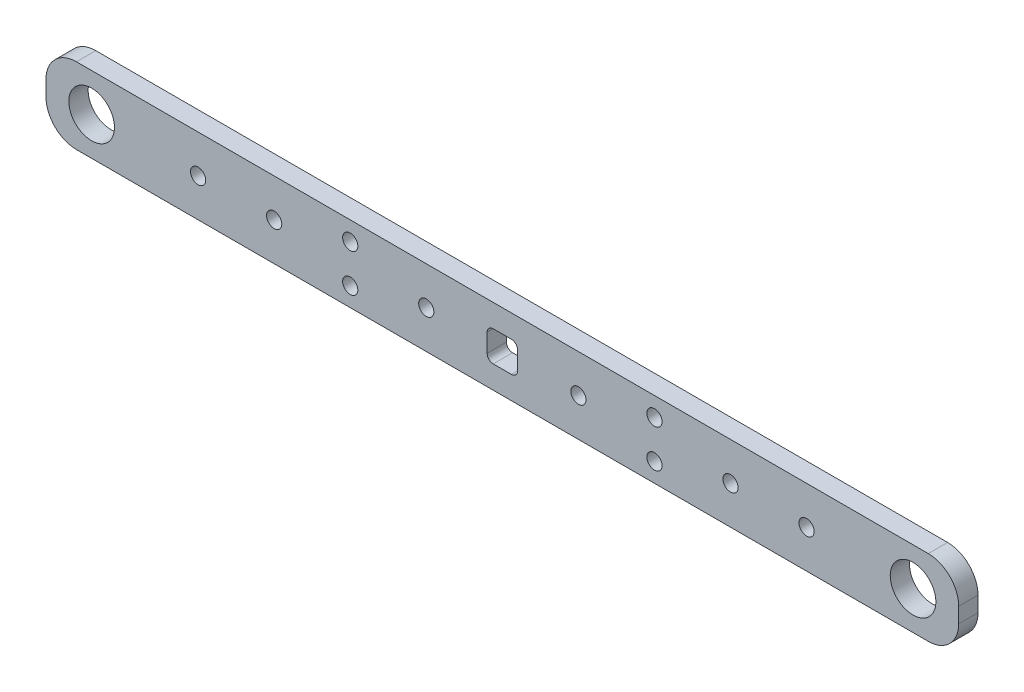
ISO-10303-21;
HEADER;
FILE_DESCRIPTION(('STEP AP214'),'2;1');
FILE_NAME('part.step','',(''),(''),'','','');
FILE_SCHEMA(('AUTOMOTIVE_DESIGN { 1 0 10303 214 1 1 1 1 }'));
ENDSEC;
DATA;
#1=APPLICATION_CONTEXT('core data for automotive mechanical design processes');
#2=APPLICATION_PROTOCOL_DEFINITION('international standard','automotive_design',2000,#1);
#3=PRODUCT_CONTEXT('',#1,'mechanical');
#4=PRODUCT('Part','Part','',(#3));
#5=PRODUCT_RELATED_PRODUCT_CATEGORY('part','',(#4));
#6=PRODUCT_DEFINITION_FORMATION('','',#4);
#7=PRODUCT_DEFINITION_CONTEXT('part definition',#1,'design');
#8=PRODUCT_DEFINITION('design','',#6,#7);
#9=PRODUCT_DEFINITION_SHAPE('','',#8);
#10=(LENGTH_UNIT() NAMED_UNIT(*) SI_UNIT(.MILLI.,.METRE.));
#11=(NAMED_UNIT(*) PLANE_ANGLE_UNIT() SI_UNIT($,.RADIAN.));
#12=(NAMED_UNIT(*) SI_UNIT($,.STERADIAN.) SOLID_ANGLE_UNIT());
#13=UNCERTAINTY_MEASURE_WITH_UNIT(LENGTH_MEASURE(1.E-05),#10,'distance_accuracy_value','');
#14=(GEOMETRIC_REPRESENTATION_CONTEXT(3) GLOBAL_UNCERTAINTY_ASSIGNED_CONTEXT((#13)) GLOBAL_UNIT_ASSIGNED_CONTEXT((#10,
#11,#12)) REPRESENTATION_CONTEXT('',''));
#15=CARTESIAN_POINT('',(0.,0.,0.));
#16=DIRECTION('',(0.,0.,1.));
#17=DIRECTION('',(1.,0.,0.));
#18=AXIS2_PLACEMENT_3D('',#15,#16,#17);
#19=CARTESIAN_POINT('',(0.,0.,3.175));
#20=DIRECTION('',(0.,0.,1.));
#21=DIRECTION('',(1.,0.,0.));
#22=AXIS2_PLACEMENT_3D('',#19,#20,#21);
#23=PLANE('',#22);
#24=CARTESIAN_POINT('',(100.,-4.45849784240948E-13,3.175));
#25=DIRECTION('',(0.,0.,1.));
#26=DIRECTION('',(1.,0.,0.));
#27=AXIS2_PLACEMENT_3D('',#24,#25,#26);
#28=CIRCLE('',#27,2.5);
#29=CARTESIAN_POINT('',(102.5,-4.45849784240948E-13,3.175));
#30=VERTEX_POINT('',#29);
#31=EDGE_CURVE('E342',#30,#30,#28,.T.);
#32=ORIENTED_EDGE('',*,*,#31,.F.);
#33=EDGE_LOOP('',(#32));
#34=FACE_BOUND('',#33,.T.);
#35=CARTESIAN_POINT('',(-100.,0.,3.175));
#36=DIRECTION('',(0.,0.,1.));
#37=DIRECTION('',(1.,0.,0.));
#38=AXIS2_PLACEMENT_3D('',#35,#36,#37);
#39=CIRCLE('',#38,2.5);
#40=CARTESIAN_POINT('',(-97.5,0.,3.175));
#41=VERTEX_POINT('',#40);
#42=EDGE_CURVE('E736',#41,#41,#39,.T.);
#43=ORIENTED_EDGE('',*,*,#42,.F.);
#44=EDGE_LOOP('',(#43));
#45=FACE_BOUND('',#44,.T.);
#46=CARTESIAN_POINT('',(50.,6.24999999999978,3.175));
#47=DIRECTION('',(0.,0.,1.));
#48=DIRECTION('',(1.,0.,0.));
#49=AXIS2_PLACEMENT_3D('',#46,#47,#48);
#50=CIRCLE('',#49,2.50000000000001);
#51=CARTESIAN_POINT('',(52.5,6.24999999999978,3.175));
#52=VERTEX_POINT('',#51);
#53=EDGE_CURVE('E732',#52,#52,#50,.T.);
#54=ORIENTED_EDGE('',*,*,#53,.F.);
#55=EDGE_LOOP('',(#54));
#56=FACE_BOUND('',#55,.T.);
#57=CARTESIAN_POINT('',(50.,-6.25000000000023,3.175));
#58=DIRECTION('',(0.,0.,1.));
#59=DIRECTION('',(1.,0.,0.));
#60=AXIS2_PLACEMENT_3D('',#57,#58,#59);
#61=CIRCLE('',#60,2.5);
#62=CARTESIAN_POINT('',(52.5,-6.25000000000023,3.175));
#63=VERTEX_POINT('',#62);
#64=EDGE_CURVE('E728',#63,#63,#61,.T.);
#65=ORIENTED_EDGE('',*,*,#64,.F.);
#66=EDGE_LOOP('',(#65));
#67=FACE_BOUND('',#66,.T.);
#68=CARTESIAN_POINT('',(-50.,-6.25000000000001,3.175));
#69=DIRECTION('',(0.,0.,1.));
#70=DIRECTION('',(1.,0.,0.));
#71=AXIS2_PLACEMENT_3D('',#68,#69,#70);
#72=CIRCLE('',#71,2.5);
#73=CARTESIAN_POINT('',(-47.5,-6.25000000000001,3.175));
#74=VERTEX_POINT('',#73);
#75=EDGE_CURVE('E724',#74,#74,#72,.T.);
#76=ORIENTED_EDGE('',*,*,#75,.F.);
#77=EDGE_LOOP('',(#76));
#78=FACE_BOUND('',#77,.T.);
#79=CARTESIAN_POINT('',(-50.,6.25,3.175));
#80=DIRECTION('',(0.,0.,1.));
#81=DIRECTION('',(1.,0.,0.));
#82=AXIS2_PLACEMENT_3D('',#79,#80,#81);
#83=CIRCLE('',#82,2.5);
#84=CARTESIAN_POINT('',(-47.5,6.25,3.175));
#85=VERTEX_POINT('',#84);
#86=EDGE_CURVE('E719',#85,#85,#83,.T.);
#87=ORIENTED_EDGE('',*,*,#86,.F.);
#88=EDGE_LOOP('',(#87));
#89=FACE_BOUND('',#88,.T.);
#90=CARTESIAN_POINT('',(75.,-3.33066907387547E-13,3.175));
#91=DIRECTION('',(0.,0.,1.));
#92=DIRECTION('',(1.,0.,0.));
#93=AXIS2_PLACEMENT_3D('',#90,#91,#92);
#94=CIRCLE('',#93,2.5);
#95=CARTESIAN_POINT('',(77.5,-3.33066907387547E-13,3.175));
#96=VERTEX_POINT('',#95);
#97=EDGE_CURVE('E367',#96,#96,#94,.T.);
#98=ORIENTED_EDGE('',*,*,#97,.F.);
#99=EDGE_LOOP('',(#98));
#100=FACE_BOUND('',#99,.T.);
#101=CARTESIAN_POINT('',(25.,-1.11022302462516E-13,3.175));
#102=DIRECTION('',(0.,0.,1.));
#103=DIRECTION('',(1.,0.,0.));
#104=AXIS2_PLACEMENT_3D('',#101,#102,#103);
#105=CIRCLE('',#104,2.5);
#106=CARTESIAN_POINT('',(27.5,-1.11022302462516E-13,3.175));
#107=VERTEX_POINT('',#106);
#108=EDGE_CURVE('E363',#107,#107,#105,.T.);
#109=ORIENTED_EDGE('',*,*,#108,.F.);
#110=EDGE_LOOP('',(#109));
#111=FACE_BOUND('',#110,.T.);
#112=DIRECTION('',(0.,1.,0.));
#113=VECTOR('',#112,1.);
#114=CARTESIAN_POINT('',(5.,0.,3.175));
#115=LINE('',#114,#113);
#116=CARTESIAN_POINT('',(5.,-3.,3.175));
#117=VERTEX_POINT('',#116);
#118=CARTESIAN_POINT('',(5.,3.,3.175));
#119=VERTEX_POINT('',#118);
#120=EDGE_CURVE('E360',#117,#119,#115,.T.);
#121=ORIENTED_EDGE('',*,*,#120,.F.);
#122=CARTESIAN_POINT('',(3.,-3.,3.175));
#123=DIRECTION('',(0.,0.,1.));
#124=DIRECTION('',(1.,0.,0.));
#125=AXIS2_PLACEMENT_3D('',#122,#123,#124);
#126=CIRCLE('',#125,2.);
#127=CARTESIAN_POINT('',(3.,-5.,3.175));
#128=VERTEX_POINT('',#127);
#129=EDGE_CURVE('E288',#117,#128,#126,.F.);
#130=ORIENTED_EDGE('',*,*,#129,.T.);
#131=DIRECTION('',(1.,0.,0.));
#132=VECTOR('',#131,1.);
#133=CARTESIAN_POINT('',(0.,-5.,3.175));
#134=LINE('',#133,#132);
#135=CARTESIAN_POINT('',(-3.,-5.,3.175));
#136=VERTEX_POINT('',#135);
#137=EDGE_CURVE('E356',#136,#128,#134,.T.);
#138=ORIENTED_EDGE('',*,*,#137,.F.);
#139=CARTESIAN_POINT('',(-3.,-3.,3.175));
#140=DIRECTION('',(0.,0.,1.));
#141=DIRECTION('',(1.,0.,0.));
#142=AXIS2_PLACEMENT_3D('',#139,#140,#141);
#143=CIRCLE('',#142,2.);
#144=CARTESIAN_POINT('',(-5.,-3.,3.175));
#145=VERTEX_POINT('',#144);
#146=EDGE_CURVE('E276',#136,#145,#143,.F.);
#147=ORIENTED_EDGE('',*,*,#146,.T.);
#148=DIRECTION('',(0.,-1.,0.));
#149=VECTOR('',#148,1.);
#150=CARTESIAN_POINT('',(-5.,0.,3.175));
#151=LINE('',#150,#149);
#152=CARTESIAN_POINT('',(-5.,3.,3.175));
#153=VERTEX_POINT('',#152);
#154=EDGE_CURVE('E301',#153,#145,#151,.T.);
#155=ORIENTED_EDGE('',*,*,#154,.F.);
#156=CARTESIAN_POINT('',(-3.,3.,3.175));
#157=DIRECTION('',(0.,0.,1.));
#158=DIRECTION('',(1.,0.,0.));
#159=AXIS2_PLACEMENT_3D('',#156,#157,#158);
#160=CIRCLE('',#159,2.);
#161=CARTESIAN_POINT('',(-3.,5.,3.175));
#162=VERTEX_POINT('',#161);
#163=EDGE_CURVE('E52',#153,#162,#160,.F.);
#164=ORIENTED_EDGE('',*,*,#163,.T.);
#165=DIRECTION('',(-1.,0.,0.));
#166=VECTOR('',#165,1.);
#167=CARTESIAN_POINT('',(0.,5.,3.175));
#168=LINE('',#167,#166);
#169=CARTESIAN_POINT('',(3.,5.,3.175));
#170=VERTEX_POINT('',#169);
#171=EDGE_CURVE('E299',#170,#162,#168,.T.);
#172=ORIENTED_EDGE('',*,*,#171,.F.);
#173=CARTESIAN_POINT('',(3.,3.,3.175));
#174=DIRECTION('',(0.,0.,1.));
#175=DIRECTION('',(1.,0.,0.));
#176=AXIS2_PLACEMENT_3D('',#173,#174,#175);
#177=CIRCLE('',#176,2.);
#178=EDGE_CURVE('E282',#170,#119,#177,.F.);
#179=ORIENTED_EDGE('',*,*,#178,.T.);
#180=EDGE_LOOP('',(#121,#130,#138,#147,#155,#164,#172,#179));
#181=FACE_BOUND('',#180,.T.);
#182=CARTESIAN_POINT('',(-75.,0.,3.175));
#183=DIRECTION('',(0.,0.,1.));
#184=DIRECTION('',(1.,0.,0.));
#185=AXIS2_PLACEMENT_3D('',#182,#183,#184);
#186=CIRCLE('',#185,2.5);
#187=CARTESIAN_POINT('',(-72.5,0.,3.175));
#188=VERTEX_POINT('',#187);
#189=EDGE_CURVE('E311',#188,#188,#186,.T.);
#190=ORIENTED_EDGE('',*,*,#189,.F.);
#191=EDGE_LOOP('',(#190));
#192=FACE_BOUND('',#191,.T.);
#193=CARTESIAN_POINT('',(-25.,0.,3.175));
#194=DIRECTION('',(0.,0.,1.));
#195=DIRECTION('',(1.,0.,0.));
#196=AXIS2_PLACEMENT_3D('',#193,#194,#195);
#197=CIRCLE('',#196,2.5);
#198=CARTESIAN_POINT('',(-22.5,0.,3.175));
#199=VERTEX_POINT('',#198);
#200=EDGE_CURVE('E347',#199,#199,#197,.T.);
#201=ORIENTED_EDGE('',*,*,#200,.F.);
#202=EDGE_LOOP('',(#201));
#203=FACE_BOUND('',#202,.T.);
#204=CARTESIAN_POINT('',(-135.,0.,3.175));
#205=DIRECTION('',(0.,0.,1.));
#206=DIRECTION('',(1.,0.,0.));
#207=AXIS2_PLACEMENT_3D('',#204,#205,#206);
#208=CIRCLE('',#207,7.50000000000001);
#209=CARTESIAN_POINT('',(-127.5,0.,3.175));
#210=VERTEX_POINT('',#209);
#211=EDGE_CURVE('E189',#210,#210,#208,.T.);
#212=ORIENTED_EDGE('',*,*,#211,.F.);
#213=EDGE_LOOP('',(#212));
#214=FACE_BOUND('',#213,.T.);
#215=DIRECTION('',(1.,0.,0.));
#216=VECTOR('',#215,1.);
#217=CARTESIAN_POINT('',(-150.,-12.5,3.175));
#218=LINE('',#217,#216);
#219=CARTESIAN_POINT('',(-140.,-12.5,3.175));
#220=VERTEX_POINT('',#219);
#221=CARTESIAN_POINT('',(140.,-12.5,3.175));
#222=VERTEX_POINT('',#221);
#223=EDGE_CURVE('E200',#220,#222,#218,.T.);
#224=ORIENTED_EDGE('',*,*,#223,.T.);
#225=CARTESIAN_POINT('',(140.,-2.5,3.175));
#226=DIRECTION('',(0.,0.,1.));
#227=DIRECTION('',(1.,0.,0.));
#228=AXIS2_PLACEMENT_3D('',#225,#226,#227);
#229=CIRCLE('',#228,10.);
#230=CARTESIAN_POINT('',(150.,-2.5,3.175));
#231=VERTEX_POINT('',#230);
#232=EDGE_CURVE('E232',#222,#231,#229,.T.);
#233=ORIENTED_EDGE('',*,*,#232,.T.);
#234=DIRECTION('',(0.,1.,0.));
#235=VECTOR('',#234,1.);
#236=CARTESIAN_POINT('',(150.,12.5,3.175));
#237=LINE('',#236,#235);
#238=CARTESIAN_POINT('',(150.,2.5,3.175));
#239=VERTEX_POINT('',#238);
#240=EDGE_CURVE('E179',#231,#239,#237,.T.);
#241=ORIENTED_EDGE('',*,*,#240,.T.);
#242=CARTESIAN_POINT('',(140.,2.5,3.175));
#243=DIRECTION('',(0.,0.,1.));
#244=DIRECTION('',(1.,0.,0.));
#245=AXIS2_PLACEMENT_3D('',#242,#243,#244);
#246=CIRCLE('',#245,10.);
#247=CARTESIAN_POINT('',(140.,12.5,3.175));
#248=VERTEX_POINT('',#247);
#249=EDGE_CURVE('E223',#239,#248,#246,.T.);
#250=ORIENTED_EDGE('',*,*,#249,.T.);
#251=DIRECTION('',(-1.,0.,0.));
#252=VECTOR('',#251,1.);
#253=CARTESIAN_POINT('',(-150.,12.5,3.175));
#254=LINE('',#253,#252);
#255=CARTESIAN_POINT('',(-140.,12.5,3.175));
#256=VERTEX_POINT('',#255);
#257=EDGE_CURVE('E384',#248,#256,#254,.T.);
#258=ORIENTED_EDGE('',*,*,#257,.T.);
#259=CARTESIAN_POINT('',(-140.,2.5,3.175));
#260=DIRECTION('',(0.,0.,1.));
#261=DIRECTION('',(1.,0.,0.));
#262=AXIS2_PLACEMENT_3D('',#259,#260,#261);
#263=CIRCLE('',#262,10.);
#264=CARTESIAN_POINT('',(-150.,2.5,3.175));
#265=VERTEX_POINT('',#264);
#266=EDGE_CURVE('E226',#256,#265,#263,.T.);
#267=ORIENTED_EDGE('',*,*,#266,.T.);
#268=DIRECTION('',(0.,-1.,0.));
#269=VECTOR('',#268,1.);
#270=CARTESIAN_POINT('',(-150.,12.5,3.175));
#271=LINE('',#270,#269);
#272=CARTESIAN_POINT('',(-150.,-2.5,3.175));
#273=VERTEX_POINT('',#272);
#274=EDGE_CURVE('E387',#265,#273,#271,.T.);
#275=ORIENTED_EDGE('',*,*,#274,.T.);
#276=CARTESIAN_POINT('',(-140.,-2.5,3.175));
#277=DIRECTION('',(0.,0.,1.));
#278=DIRECTION('',(1.,0.,0.));
#279=AXIS2_PLACEMENT_3D('',#276,#277,#278);
#280=CIRCLE('',#279,10.);
#281=EDGE_CURVE('E229',#273,#220,#280,.T.);
#282=ORIENTED_EDGE('',*,*,#281,.T.);
#283=EDGE_LOOP('',(#224,#233,#241,#250,#258,#267,#275,#282));
#284=FACE_BOUND('',#283,.T.);
#285=CARTESIAN_POINT('',(135.,0.,3.175));
#286=DIRECTION('',(0.,0.,1.));
#287=DIRECTION('',(-1.,0.,0.));
#288=AXIS2_PLACEMENT_3D('',#285,#286,#287);
#289=CIRCLE('',#288,7.50000000000001);
#290=CARTESIAN_POINT('',(127.5,0.,3.175));
#291=VERTEX_POINT('',#290);
#292=EDGE_CURVE('E372',#291,#291,#289,.T.);
#293=ORIENTED_EDGE('',*,*,#292,.F.);
#294=EDGE_LOOP('',(#293));
#295=FACE_BOUND('',#294,.T.);
#296=ADVANCED_FACE('F43',(#34,#45,#56,#67,#78,#89,#100,#111,#181,#192,#203,#214,#284,#295),#23,.T.);
#297=CARTESIAN_POINT('',(0.,0.,-3.175));
#298=DIRECTION('',(0.,0.,1.));
#299=DIRECTION('',(1.,0.,0.));
#300=AXIS2_PLACEMENT_3D('',#297,#298,#299);
#301=PLANE('',#300);
#302=CARTESIAN_POINT('',(100.,-4.45849784240948E-13,-3.175));
#303=DIRECTION('',(0.,0.,1.));
#304=DIRECTION('',(-1.,0.,0.));
#305=AXIS2_PLACEMENT_3D('',#302,#303,#304);
#306=CIRCLE('',#305,2.5);
#307=CARTESIAN_POINT('',(97.5,-4.45849784240948E-13,-3.175));
#308=VERTEX_POINT('',#307);
#309=EDGE_CURVE('E705',#308,#308,#306,.T.);
#310=ORIENTED_EDGE('',*,*,#309,.T.);
#311=EDGE_LOOP('',(#310));
#312=FACE_BOUND('',#311,.T.);
#313=CARTESIAN_POINT('',(-100.,0.,-3.175));
#314=DIRECTION('',(0.,0.,1.));
#315=DIRECTION('',(1.,0.,0.));
#316=AXIS2_PLACEMENT_3D('',#313,#314,#315);
#317=CIRCLE('',#316,2.5);
#318=CARTESIAN_POINT('',(-97.5,0.,-3.175));
#319=VERTEX_POINT('',#318);
#320=EDGE_CURVE('E707',#319,#319,#317,.T.);
#321=ORIENTED_EDGE('',*,*,#320,.T.);
#322=EDGE_LOOP('',(#321));
#323=FACE_BOUND('',#322,.T.);
#324=CARTESIAN_POINT('',(50.,6.24999999999978,-3.175));
#325=DIRECTION('',(0.,0.,1.));
#326=DIRECTION('',(-1.,0.,0.));
#327=AXIS2_PLACEMENT_3D('',#324,#325,#326);
#328=CIRCLE('',#327,2.50000000000001);
#329=CARTESIAN_POINT('',(47.5,6.24999999999978,-3.175));
#330=VERTEX_POINT('',#329);
#331=EDGE_CURVE('E711',#330,#330,#328,.T.);
#332=ORIENTED_EDGE('',*,*,#331,.T.);
#333=EDGE_LOOP('',(#332));
#334=FACE_BOUND('',#333,.T.);
#335=CARTESIAN_POINT('',(50.,-6.25000000000023,-3.175));
#336=DIRECTION('',(0.,0.,1.));
#337=DIRECTION('',(1.,0.,0.));
#338=AXIS2_PLACEMENT_3D('',#335,#336,#337);
#339=CIRCLE('',#338,2.5);
#340=CARTESIAN_POINT('',(52.5,-6.25000000000023,-3.175));
#341=VERTEX_POINT('',#340);
#342=EDGE_CURVE('E754',#341,#341,#339,.T.);
#343=ORIENTED_EDGE('',*,*,#342,.T.);
#344=EDGE_LOOP('',(#343));
#345=FACE_BOUND('',#344,.T.);
#346=CARTESIAN_POINT('',(-50.,-6.25000000000001,-3.175));
#347=DIRECTION('',(0.,0.,1.));
#348=DIRECTION('',(-1.,0.,0.));
#349=AXIS2_PLACEMENT_3D('',#346,#347,#348);
#350=CIRCLE('',#349,2.5);
#351=CARTESIAN_POINT('',(-52.5,-6.25000000000001,-3.175));
#352=VERTEX_POINT('',#351);
#353=EDGE_CURVE('E720',#352,#352,#350,.T.);
#354=ORIENTED_EDGE('',*,*,#353,.T.);
#355=EDGE_LOOP('',(#354));
#356=FACE_BOUND('',#355,.T.);
#357=CARTESIAN_POINT('',(-50.,6.25,-3.175));
#358=DIRECTION('',(0.,0.,1.));
#359=DIRECTION('',(1.,0.,0.));
#360=AXIS2_PLACEMENT_3D('',#357,#358,#359);
#361=CIRCLE('',#360,2.5);
#362=CARTESIAN_POINT('',(-47.5,6.25,-3.175));
#363=VERTEX_POINT('',#362);
#364=EDGE_CURVE('E715',#363,#363,#361,.T.);
#365=ORIENTED_EDGE('',*,*,#364,.T.);
#366=EDGE_LOOP('',(#365));
#367=FACE_BOUND('',#366,.T.);
#368=CARTESIAN_POINT('',(75.,-3.33066907387547E-13,-3.175));
#369=DIRECTION('',(0.,0.,1.));
#370=DIRECTION('',(-1.,0.,0.));
#371=AXIS2_PLACEMENT_3D('',#368,#369,#370);
#372=CIRCLE('',#371,2.5);
#373=CARTESIAN_POINT('',(72.5,-3.33066907387547E-13,-3.175));
#374=VERTEX_POINT('',#373);
#375=EDGE_CURVE('E338',#374,#374,#372,.T.);
#376=ORIENTED_EDGE('',*,*,#375,.T.);
#377=EDGE_LOOP('',(#376));
#378=FACE_BOUND('',#377,.T.);
#379=CARTESIAN_POINT('',(25.,-1.11022302462516E-13,-3.175));
#380=DIRECTION('',(0.,0.,1.));
#381=DIRECTION('',(-1.,0.,0.));
#382=AXIS2_PLACEMENT_3D('',#379,#380,#381);
#383=CIRCLE('',#382,2.5);
#384=CARTESIAN_POINT('',(22.5,-1.11022302462516E-13,-3.175));
#385=VERTEX_POINT('',#384);
#386=EDGE_CURVE('E334',#385,#385,#383,.T.);
#387=ORIENTED_EDGE('',*,*,#386,.T.);
#388=EDGE_LOOP('',(#387));
#389=FACE_BOUND('',#388,.T.);
#390=DIRECTION('',(0.,-1.,0.));
#391=VECTOR('',#390,1.);
#392=CARTESIAN_POINT('',(-5.,5.,-3.175));
#393=LINE('',#392,#391);
#394=CARTESIAN_POINT('',(-5.,3.,-3.175));
#395=VERTEX_POINT('',#394);
#396=CARTESIAN_POINT('',(-5.,-3.,-3.175));
#397=VERTEX_POINT('',#396);
#398=EDGE_CURVE('E317',#395,#397,#393,.T.);
#399=ORIENTED_EDGE('',*,*,#398,.T.);
#400=CARTESIAN_POINT('',(-3.,-3.,-3.175));
#401=DIRECTION('',(0.,0.,1.));
#402=DIRECTION('',(1.,0.,0.));
#403=AXIS2_PLACEMENT_3D('',#400,#401,#402);
#404=CIRCLE('',#403,2.);
#405=CARTESIAN_POINT('',(-3.,-5.,-3.175));
#406=VERTEX_POINT('',#405);
#407=EDGE_CURVE('E279',#397,#406,#404,.T.);
#408=ORIENTED_EDGE('',*,*,#407,.T.);
#409=DIRECTION('',(1.,0.,0.));
#410=VECTOR('',#409,1.);
#411=CARTESIAN_POINT('',(-5.,-5.,-3.175));
#412=LINE('',#411,#410);
#413=CARTESIAN_POINT('',(3.,-5.,-3.175));
#414=VERTEX_POINT('',#413);
#415=EDGE_CURVE('E324',#406,#414,#412,.T.);
#416=ORIENTED_EDGE('',*,*,#415,.T.);
#417=CARTESIAN_POINT('',(3.,-3.,-3.175));
#418=DIRECTION('',(0.,0.,1.));
#419=DIRECTION('',(1.,0.,0.));
#420=AXIS2_PLACEMENT_3D('',#417,#418,#419);
#421=CIRCLE('',#420,2.);
#422=CARTESIAN_POINT('',(5.,-3.,-3.175));
#423=VERTEX_POINT('',#422);
#424=EDGE_CURVE('E66',#414,#423,#421,.T.);
#425=ORIENTED_EDGE('',*,*,#424,.T.);
#426=DIRECTION('',(0.,1.,0.));
#427=VECTOR('',#426,1.);
#428=CARTESIAN_POINT('',(5.,5.,-3.175));
#429=LINE('',#428,#427);
#430=CARTESIAN_POINT('',(5.,3.,-3.175));
#431=VERTEX_POINT('',#430);
#432=EDGE_CURVE('E330',#423,#431,#429,.T.);
#433=ORIENTED_EDGE('',*,*,#432,.T.);
#434=CARTESIAN_POINT('',(3.,3.,-3.175));
#435=DIRECTION('',(0.,0.,1.));
#436=DIRECTION('',(1.,0.,0.));
#437=AXIS2_PLACEMENT_3D('',#434,#435,#436);
#438=CIRCLE('',#437,2.);
#439=CARTESIAN_POINT('',(3.,5.,-3.175));
#440=VERTEX_POINT('',#439);
#441=EDGE_CURVE('E285',#431,#440,#438,.T.);
#442=ORIENTED_EDGE('',*,*,#441,.T.);
#443=DIRECTION('',(-1.,0.,0.));
#444=VECTOR('',#443,1.);
#445=CARTESIAN_POINT('',(-5.,5.,-3.175));
#446=LINE('',#445,#444);
#447=CARTESIAN_POINT('',(-3.,5.,-3.175));
#448=VERTEX_POINT('',#447);
#449=EDGE_CURVE('E319',#440,#448,#446,.T.);
#450=ORIENTED_EDGE('',*,*,#449,.T.);
#451=CARTESIAN_POINT('',(-3.,3.,-3.175));
#452=DIRECTION('',(0.,0.,1.));
#453=DIRECTION('',(1.,0.,0.));
#454=AXIS2_PLACEMENT_3D('',#451,#452,#453);
#455=CIRCLE('',#454,2.);
#456=EDGE_CURVE('E11',#448,#395,#455,.T.);
#457=ORIENTED_EDGE('',*,*,#456,.T.);
#458=EDGE_LOOP('',(#399,#408,#416,#425,#433,#442,#450,#457));
#459=FACE_BOUND('',#458,.T.);
#460=CARTESIAN_POINT('',(-75.,0.,-3.175));
#461=DIRECTION('',(0.,0.,1.));
#462=DIRECTION('',(1.,0.,0.));
#463=AXIS2_PLACEMENT_3D('',#460,#461,#462);
#464=CIRCLE('',#463,2.5);
#465=CARTESIAN_POINT('',(-72.5,0.,-3.175));
#466=VERTEX_POINT('',#465);
#467=EDGE_CURVE('E328',#466,#466,#464,.T.);
#468=ORIENTED_EDGE('',*,*,#467,.T.);
#469=EDGE_LOOP('',(#468));
#470=FACE_BOUND('',#469,.T.);
#471=CARTESIAN_POINT('',(-25.,0.,-3.175));
#472=DIRECTION('',(0.,0.,1.));
#473=DIRECTION('',(1.,0.,0.));
#474=AXIS2_PLACEMENT_3D('',#471,#472,#473);
#475=CIRCLE('',#474,2.5);
#476=CARTESIAN_POINT('',(-22.5,0.,-3.175));
#477=VERTEX_POINT('',#476);
#478=EDGE_CURVE('E343',#477,#477,#475,.T.);
#479=ORIENTED_EDGE('',*,*,#478,.T.);
#480=EDGE_LOOP('',(#479));
#481=FACE_BOUND('',#480,.T.);
#482=DIRECTION('',(0.,1.,0.));
#483=VECTOR('',#482,1.);
#484=CARTESIAN_POINT('',(150.,12.5,-3.175));
#485=LINE('',#484,#483);
#486=CARTESIAN_POINT('',(150.,-2.5,-3.175));
#487=VERTEX_POINT('',#486);
#488=CARTESIAN_POINT('',(150.,2.5,-3.175));
#489=VERTEX_POINT('',#488);
#490=EDGE_CURVE('E176',#487,#489,#485,.T.);
#491=ORIENTED_EDGE('',*,*,#490,.F.);
#492=CARTESIAN_POINT('',(140.,-2.5,-3.175));
#493=DIRECTION('',(0.,0.,1.));
#494=DIRECTION('',(1.,0.,0.));
#495=AXIS2_PLACEMENT_3D('',#492,#493,#494);
#496=CIRCLE('',#495,10.);
#497=CARTESIAN_POINT('',(140.,-12.5,-3.175));
#498=VERTEX_POINT('',#497);
#499=EDGE_CURVE('E158',#487,#498,#496,.F.);
#500=ORIENTED_EDGE('',*,*,#499,.T.);
#501=DIRECTION('',(1.,0.,0.));
#502=VECTOR('',#501,1.);
#503=CARTESIAN_POINT('',(-150.,-12.5,-3.175));
#504=LINE('',#503,#502);
#505=CARTESIAN_POINT('',(-140.,-12.5,-3.175));
#506=VERTEX_POINT('',#505);
#507=EDGE_CURVE('E206',#506,#498,#504,.T.);
#508=ORIENTED_EDGE('',*,*,#507,.F.);
#509=CARTESIAN_POINT('',(-140.,-2.5,-3.175));
#510=DIRECTION('',(0.,0.,1.));
#511=DIRECTION('',(1.,0.,0.));
#512=AXIS2_PLACEMENT_3D('',#509,#510,#511);
#513=CIRCLE('',#512,10.);
#514=CARTESIAN_POINT('',(-150.,-2.5,-3.175));
#515=VERTEX_POINT('',#514);
#516=EDGE_CURVE('E170',#506,#515,#513,.F.);
#517=ORIENTED_EDGE('',*,*,#516,.T.);
#518=DIRECTION('',(0.,-1.,0.));
#519=VECTOR('',#518,1.);
#520=CARTESIAN_POINT('',(-150.,12.5,-3.175));
#521=LINE('',#520,#519);
#522=CARTESIAN_POINT('',(-150.,2.5,-3.175));
#523=VERTEX_POINT('',#522);
#524=EDGE_CURVE('E194',#523,#515,#521,.T.);
#525=ORIENTED_EDGE('',*,*,#524,.F.);
#526=CARTESIAN_POINT('',(-140.,2.5,-3.175));
#527=DIRECTION('',(0.,0.,1.));
#528=DIRECTION('',(1.,0.,0.));
#529=AXIS2_PLACEMENT_3D('',#526,#527,#528);
#530=CIRCLE('',#529,10.);
#531=CARTESIAN_POINT('',(-140.,12.5,-3.175));
#532=VERTEX_POINT('',#531);
#533=EDGE_CURVE('E213',#523,#532,#530,.F.);
#534=ORIENTED_EDGE('',*,*,#533,.T.);
#535=DIRECTION('',(-1.,0.,0.));
#536=VECTOR('',#535,1.);
#537=CARTESIAN_POINT('',(-150.,12.5,-3.175));
#538=LINE('',#537,#536);
#539=CARTESIAN_POINT('',(140.,12.5,-3.175));
#540=VERTEX_POINT('',#539);
#541=EDGE_CURVE('E188',#540,#532,#538,.T.);
#542=ORIENTED_EDGE('',*,*,#541,.F.);
#543=CARTESIAN_POINT('',(140.,2.5,-3.175));
#544=DIRECTION('',(0.,0.,1.));
#545=DIRECTION('',(1.,0.,0.));
#546=AXIS2_PLACEMENT_3D('',#543,#544,#545);
#547=CIRCLE('',#546,10.);
#548=EDGE_CURVE('E181',#540,#489,#547,.F.);
#549=ORIENTED_EDGE('',*,*,#548,.T.);
#550=EDGE_LOOP('',(#491,#500,#508,#517,#525,#534,#542,#549));
#551=FACE_BOUND('',#550,.T.);
#552=CARTESIAN_POINT('',(-135.,0.,-3.175));
#553=DIRECTION('',(0.,0.,1.));
#554=DIRECTION('',(1.,0.,0.));
#555=AXIS2_PLACEMENT_3D('',#552,#553,#554);
#556=CIRCLE('',#555,7.50000000000001);
#557=CARTESIAN_POINT('',(-127.5,0.,-3.175));
#558=VERTEX_POINT('',#557);
#559=EDGE_CURVE('E197',#558,#558,#556,.T.);
#560=ORIENTED_EDGE('',*,*,#559,.T.);
#561=EDGE_LOOP('',(#560));
#562=FACE_BOUND('',#561,.T.);
#563=CARTESIAN_POINT('',(135.,0.,-3.175));
#564=DIRECTION('',(0.,0.,1.));
#565=DIRECTION('',(-1.,0.,0.));
#566=AXIS2_PLACEMENT_3D('',#563,#564,#565);
#567=CIRCLE('',#566,7.50000000000001);
#568=CARTESIAN_POINT('',(127.5,0.,-3.175));
#569=VERTEX_POINT('',#568);
#570=EDGE_CURVE('E371',#569,#569,#567,.T.);
#571=ORIENTED_EDGE('',*,*,#570,.T.);
#572=EDGE_LOOP('',(#571));
#573=FACE_BOUND('',#572,.T.);
#574=ADVANCED_FACE('F184',(#312,#323,#334,#345,#356,#367,#378,#389,#459,#470,#481,#551,#562,
#573),#301,.F.);
#575=CARTESIAN_POINT('',(150.,12.5,3.175));
#576=DIRECTION('',(-1.,0.,0.));
#577=DIRECTION('',(0.,0.,1.));
#578=AXIS2_PLACEMENT_3D('',#575,#576,#577);
#579=PLANE('',#578);
#580=ORIENTED_EDGE('',*,*,#240,.F.);
#581=DIRECTION('',(0.,0.,-1.));
#582=VECTOR('',#581,1.);
#583=CARTESIAN_POINT('',(150.,-2.5,3.175));
#584=LINE('',#583,#582);
#585=EDGE_CURVE('E162',#231,#487,#584,.T.);
#586=ORIENTED_EDGE('',*,*,#585,.T.);
#587=ORIENTED_EDGE('',*,*,#490,.T.);
#588=DIRECTION('',(0.,0.,-1.));
#589=VECTOR('',#588,1.);
#590=CARTESIAN_POINT('',(150.,2.5,3.175));
#591=LINE('',#590,#589);
#592=EDGE_CURVE('E182',#489,#239,#591,.F.);
#593=ORIENTED_EDGE('',*,*,#592,.T.);
#594=EDGE_LOOP('',(#580,#586,#587,#593));
#595=FACE_BOUND('',#594,.T.);
#596=ADVANCED_FACE('F175',(#595),#579,.F.);
#597=CARTESIAN_POINT('',(-150.,12.5,3.175));
#598=DIRECTION('',(0.,-1.,0.));
#599=DIRECTION('',(1.,0.,0.));
#600=AXIS2_PLACEMENT_3D('',#597,#598,#599);
#601=PLANE('',#600);
#602=ORIENTED_EDGE('',*,*,#541,.T.);
#603=DIRECTION('',(0.,0.,-1.));
#604=VECTOR('',#603,1.);
#605=CARTESIAN_POINT('',(-140.,12.5,3.175));
#606=LINE('',#605,#604);
#607=EDGE_CURVE('E246',#532,#256,#606,.F.);
#608=ORIENTED_EDGE('',*,*,#607,.T.);
#609=ORIENTED_EDGE('',*,*,#257,.F.);
#610=DIRECTION('',(0.,0.,-1.));
#611=VECTOR('',#610,1.);
#612=CARTESIAN_POINT('',(140.,12.5,3.175));
#613=LINE('',#612,#611);
#614=EDGE_CURVE('E242',#248,#540,#613,.T.);
#615=ORIENTED_EDGE('',*,*,#614,.T.);
#616=EDGE_LOOP('',(#602,#608,#609,#615));
#617=FACE_BOUND('',#616,.T.);
#618=ADVANCED_FACE('F412',(#617),#601,.F.);
#619=CARTESIAN_POINT('',(-150.,12.5,3.175));
#620=DIRECTION('',(1.,0.,0.));
#621=DIRECTION('',(0.,0.,-1.));
#622=AXIS2_PLACEMENT_3D('',#619,#620,#621);
#623=PLANE('',#622);
#624=ORIENTED_EDGE('',*,*,#524,.T.);
#625=DIRECTION('',(0.,0.,-1.));
#626=VECTOR('',#625,1.);
#627=CARTESIAN_POINT('',(-150.,-2.5,3.175));
#628=LINE('',#627,#626);
#629=EDGE_CURVE('E239',#515,#273,#628,.F.);
#630=ORIENTED_EDGE('',*,*,#629,.T.);
#631=ORIENTED_EDGE('',*,*,#274,.F.);
#632=DIRECTION('',(0.,0.,-1.));
#633=VECTOR('',#632,1.);
#634=CARTESIAN_POINT('',(-150.,2.5,3.175));
#635=LINE('',#634,#633);
#636=EDGE_CURVE('E235',#265,#523,#635,.T.);
#637=ORIENTED_EDGE('',*,*,#636,.T.);
#638=EDGE_LOOP('',(#624,#630,#631,#637));
#639=FACE_BOUND('',#638,.T.);
#640=ADVANCED_FACE('F405',(#639),#623,.F.);
#641=CARTESIAN_POINT('',(-150.,-12.5,3.175));
#642=DIRECTION('',(0.,1.,0.));
#643=DIRECTION('',(0.,0.,1.));
#644=AXIS2_PLACEMENT_3D('',#641,#642,#643);
#645=PLANE('',#644);
#646=ORIENTED_EDGE('',*,*,#507,.T.);
#647=DIRECTION('',(0.,0.,-1.));
#648=VECTOR('',#647,1.);
#649=CARTESIAN_POINT('',(140.,-12.5,3.175));
#650=LINE('',#649,#648);
#651=EDGE_CURVE('E163',#498,#222,#650,.F.);
#652=ORIENTED_EDGE('',*,*,#651,.T.);
#653=ORIENTED_EDGE('',*,*,#223,.F.);
#654=DIRECTION('',(0.,0.,-1.));
#655=VECTOR('',#654,1.);
#656=CARTESIAN_POINT('',(-140.,-12.5,3.175));
#657=LINE('',#656,#655);
#658=EDGE_CURVE('E169',#220,#506,#657,.T.);
#659=ORIENTED_EDGE('',*,*,#658,.T.);
#660=EDGE_LOOP('',(#646,#652,#653,#659));
#661=FACE_BOUND('',#660,.T.);
#662=ADVANCED_FACE('F399',(#661),#645,.F.);
#663=CARTESIAN_POINT('',(-135.,0.,3.175));
#664=DIRECTION('',(0.,0.,-1.));
#665=DIRECTION('',(-1.,0.,0.));
#666=AXIS2_PLACEMENT_3D('',#663,#664,#665);
#667=CYLINDRICAL_SURFACE('',#666,7.50000000000001);
#668=ORIENTED_EDGE('',*,*,#211,.T.);
#669=EDGE_LOOP('',(#668));
#670=FACE_BOUND('',#669,.T.);
#671=ORIENTED_EDGE('',*,*,#559,.F.);
#672=EDGE_LOOP('',(#671));
#673=FACE_BOUND('',#672,.T.);
#674=ADVANCED_FACE('F441',(#670,#673),#667,.F.);
#675=CARTESIAN_POINT('',(135.,0.,3.175));
#676=DIRECTION('',(0.,0.,-1.));
#677=DIRECTION('',(-1.,0.,0.));
#678=AXIS2_PLACEMENT_3D('',#675,#676,#677);
#679=CYLINDRICAL_SURFACE('',#678,7.50000000000001);
#680=ORIENTED_EDGE('',*,*,#292,.T.);
#681=EDGE_LOOP('',(#680));
#682=FACE_BOUND('',#681,.T.);
#683=ORIENTED_EDGE('',*,*,#570,.F.);
#684=EDGE_LOOP('',(#683));
#685=FACE_BOUND('',#684,.T.);
#686=ADVANCED_FACE('F454',(#682,#685),#679,.F.);
#687=CARTESIAN_POINT('',(140.,-2.5,3.175));
#688=DIRECTION('',(0.,0.,-1.));
#689=DIRECTION('',(-1.,0.,0.));
#690=AXIS2_PLACEMENT_3D('',#687,#688,#689);
#691=CYLINDRICAL_SURFACE('',#690,10.);
#692=ORIENTED_EDGE('',*,*,#232,.F.);
#693=ORIENTED_EDGE('',*,*,#651,.F.);
#694=ORIENTED_EDGE('',*,*,#499,.F.);
#695=ORIENTED_EDGE('',*,*,#585,.F.);
#696=EDGE_LOOP('',(#692,#693,#694,#695));
#697=FACE_BOUND('',#696,.T.);
#698=ADVANCED_FACE('F161',(#697),#691,.T.);
#699=CARTESIAN_POINT('',(-140.,-2.5,3.175));
#700=DIRECTION('',(0.,0.,-1.));
#701=DIRECTION('',(-1.,0.,0.));
#702=AXIS2_PLACEMENT_3D('',#699,#700,#701);
#703=CYLINDRICAL_SURFACE('',#702,10.);
#704=ORIENTED_EDGE('',*,*,#281,.F.);
#705=ORIENTED_EDGE('',*,*,#629,.F.);
#706=ORIENTED_EDGE('',*,*,#516,.F.);
#707=ORIENTED_EDGE('',*,*,#658,.F.);
#708=EDGE_LOOP('',(#704,#705,#706,#707));
#709=FACE_BOUND('',#708,.T.);
#710=ADVANCED_FACE('F401',(#709),#703,.T.);
#711=CARTESIAN_POINT('',(-140.,2.5,3.175));
#712=DIRECTION('',(0.,0.,-1.));
#713=DIRECTION('',(-1.,0.,0.));
#714=AXIS2_PLACEMENT_3D('',#711,#712,#713);
#715=CYLINDRICAL_SURFACE('',#714,10.);
#716=ORIENTED_EDGE('',*,*,#266,.F.);
#717=ORIENTED_EDGE('',*,*,#607,.F.);
#718=ORIENTED_EDGE('',*,*,#533,.F.);
#719=ORIENTED_EDGE('',*,*,#636,.F.);
#720=EDGE_LOOP('',(#716,#717,#718,#719));
#721=FACE_BOUND('',#720,.T.);
#722=ADVANCED_FACE('F409',(#721),#715,.T.);
#723=CARTESIAN_POINT('',(140.,2.5,3.175));
#724=DIRECTION('',(0.,0.,-1.));
#725=DIRECTION('',(-1.,0.,0.));
#726=AXIS2_PLACEMENT_3D('',#723,#724,#725);
#727=CYLINDRICAL_SURFACE('',#726,10.);
#728=ORIENTED_EDGE('',*,*,#249,.F.);
#729=ORIENTED_EDGE('',*,*,#592,.F.);
#730=ORIENTED_EDGE('',*,*,#548,.F.);
#731=ORIENTED_EDGE('',*,*,#614,.F.);
#732=EDGE_LOOP('',(#728,#729,#730,#731));
#733=FACE_BOUND('',#732,.T.);
#734=ADVANCED_FACE('F417',(#733),#727,.T.);
#735=CARTESIAN_POINT('',(-25.,0.,-3.175));
#736=DIRECTION('',(0.,0.,1.));
#737=DIRECTION('',(1.,0.,0.));
#738=AXIS2_PLACEMENT_3D('',#735,#736,#737);
#739=CYLINDRICAL_SURFACE('',#738,2.5);
#740=ORIENTED_EDGE('',*,*,#200,.T.);
#741=EDGE_LOOP('',(#740));
#742=FACE_BOUND('',#741,.T.);
#743=ORIENTED_EDGE('',*,*,#478,.F.);
#744=EDGE_LOOP('',(#743));
#745=FACE_BOUND('',#744,.T.);
#746=ADVANCED_FACE('F419',(#742,#745),#739,.F.);
#747=CARTESIAN_POINT('',(-75.,0.,-3.175));
#748=DIRECTION('',(0.,0.,1.));
#749=DIRECTION('',(1.,0.,0.));
#750=AXIS2_PLACEMENT_3D('',#747,#748,#749);
#751=CYLINDRICAL_SURFACE('',#750,2.5);
#752=ORIENTED_EDGE('',*,*,#189,.T.);
#753=EDGE_LOOP('',(#752));
#754=FACE_BOUND('',#753,.T.);
#755=ORIENTED_EDGE('',*,*,#467,.F.);
#756=EDGE_LOOP('',(#755));
#757=FACE_BOUND('',#756,.T.);
#758=ADVANCED_FACE('F425',(#754,#757),#751,.F.);
#759=CARTESIAN_POINT('',(5.,5.,-3.175));
#760=DIRECTION('',(1.,0.,0.));
#761=DIRECTION('',(0.,1.,0.));
#762=AXIS2_PLACEMENT_3D('',#759,#760,#761);
#763=PLANE('',#762);
#764=ORIENTED_EDGE('',*,*,#120,.T.);
#765=DIRECTION('',(0.,0.,1.));
#766=VECTOR('',#765,1.);
#767=CARTESIAN_POINT('',(5.,3.,-3.175));
#768=LINE('',#767,#766);
#769=EDGE_CURVE('E59',#119,#431,#768,.F.);
#770=ORIENTED_EDGE('',*,*,#769,.T.);
#771=ORIENTED_EDGE('',*,*,#432,.F.);
#772=DIRECTION('',(0.,0.,1.));
#773=VECTOR('',#772,1.);
#774=CARTESIAN_POINT('',(5.,-3.,3.175));
#775=LINE('',#774,#773);
#776=EDGE_CURVE('E270',#423,#117,#775,.T.);
#777=ORIENTED_EDGE('',*,*,#776,.T.);
#778=EDGE_LOOP('',(#764,#770,#771,#777));
#779=FACE_BOUND('',#778,.T.);
#780=ADVANCED_FACE('F484',(#779),#763,.F.);
#781=CARTESIAN_POINT('',(-5.,-5.,-3.175));
#782=DIRECTION('',(0.,-1.,0.));
#783=DIRECTION('',(0.,0.,-1.));
#784=AXIS2_PLACEMENT_3D('',#781,#782,#783);
#785=PLANE('',#784);
#786=ORIENTED_EDGE('',*,*,#415,.F.);
#787=DIRECTION('',(0.,0.,1.));
#788=VECTOR('',#787,1.);
#789=CARTESIAN_POINT('',(-3.,-5.,3.175));
#790=LINE('',#789,#788);
#791=EDGE_CURVE('E252',#406,#136,#790,.T.);
#792=ORIENTED_EDGE('',*,*,#791,.T.);
#793=ORIENTED_EDGE('',*,*,#137,.T.);
#794=DIRECTION('',(0.,0.,1.));
#795=VECTOR('',#794,1.);
#796=CARTESIAN_POINT('',(3.,-5.,-3.175));
#797=LINE('',#796,#795);
#798=EDGE_CURVE('E249',#128,#414,#797,.F.);
#799=ORIENTED_EDGE('',*,*,#798,.T.);
#800=EDGE_LOOP('',(#786,#792,#793,#799));
#801=FACE_BOUND('',#800,.T.);
#802=ADVANCED_FACE('F519',(#801),#785,.F.);
#803=CARTESIAN_POINT('',(-5.,5.,-3.175));
#804=DIRECTION('',(-1.,0.,0.));
#805=DIRECTION('',(0.,-1.,0.));
#806=AXIS2_PLACEMENT_3D('',#803,#804,#805);
#807=PLANE('',#806);
#808=ORIENTED_EDGE('',*,*,#154,.T.);
#809=DIRECTION('',(0.,0.,1.));
#810=VECTOR('',#809,1.);
#811=CARTESIAN_POINT('',(-5.,-3.,-3.175));
#812=LINE('',#811,#810);
#813=EDGE_CURVE('E260',#145,#397,#812,.F.);
#814=ORIENTED_EDGE('',*,*,#813,.T.);
#815=ORIENTED_EDGE('',*,*,#398,.F.);
#816=DIRECTION('',(0.,0.,1.));
#817=VECTOR('',#816,1.);
#818=CARTESIAN_POINT('',(-5.,3.,3.175));
#819=LINE('',#818,#817);
#820=EDGE_CURVE('E256',#395,#153,#819,.T.);
#821=ORIENTED_EDGE('',*,*,#820,.T.);
#822=EDGE_LOOP('',(#808,#814,#815,#821));
#823=FACE_BOUND('',#822,.T.);
#824=ADVANCED_FACE('F321',(#823),#807,.F.);
#825=CARTESIAN_POINT('',(-5.,5.,-3.175));
#826=DIRECTION('',(0.,1.,0.));
#827=DIRECTION('',(0.,0.,1.));
#828=AXIS2_PLACEMENT_3D('',#825,#826,#827);
#829=PLANE('',#828);
#830=ORIENTED_EDGE('',*,*,#449,.F.);
#831=DIRECTION('',(0.,0.,1.));
#832=VECTOR('',#831,1.);
#833=CARTESIAN_POINT('',(3.,5.,3.175));
#834=LINE('',#833,#832);
#835=EDGE_CURVE('E266',#440,#170,#834,.T.);
#836=ORIENTED_EDGE('',*,*,#835,.T.);
#837=ORIENTED_EDGE('',*,*,#171,.T.);
#838=DIRECTION('',(0.,0.,1.));
#839=VECTOR('',#838,1.);
#840=CARTESIAN_POINT('',(-3.,5.,-3.175));
#841=LINE('',#840,#839);
#842=EDGE_CURVE('E263',#162,#448,#841,.F.);
#843=ORIENTED_EDGE('',*,*,#842,.T.);
#844=EDGE_LOOP('',(#830,#836,#837,#843));
#845=FACE_BOUND('',#844,.T.);
#846=ADVANCED_FACE('F307',(#845),#829,.F.);
#847=CARTESIAN_POINT('',(25.,-1.11022302462516E-13,-3.175));
#848=DIRECTION('',(0.,0.,1.));
#849=DIRECTION('',(1.,0.,0.));
#850=AXIS2_PLACEMENT_3D('',#847,#848,#849);
#851=CYLINDRICAL_SURFACE('',#850,2.5);
#852=ORIENTED_EDGE('',*,*,#108,.T.);
#853=EDGE_LOOP('',(#852));
#854=FACE_BOUND('',#853,.T.);
#855=ORIENTED_EDGE('',*,*,#386,.F.);
#856=EDGE_LOOP('',(#855));
#857=FACE_BOUND('',#856,.T.);
#858=ADVANCED_FACE('F492',(#854,#857),#851,.F.);
#859=CARTESIAN_POINT('',(75.,-3.33066907387547E-13,-3.175));
#860=DIRECTION('',(0.,0.,1.));
#861=DIRECTION('',(1.,0.,0.));
#862=AXIS2_PLACEMENT_3D('',#859,#860,#861);
#863=CYLINDRICAL_SURFACE('',#862,2.5);
#864=ORIENTED_EDGE('',*,*,#97,.T.);
#865=EDGE_LOOP('',(#864));
#866=FACE_BOUND('',#865,.T.);
#867=ORIENTED_EDGE('',*,*,#375,.F.);
#868=EDGE_LOOP('',(#867));
#869=FACE_BOUND('',#868,.T.);
#870=ADVANCED_FACE('F497',(#866,#869),#863,.F.);
#871=CARTESIAN_POINT('',(-3.,-3.,-3.175));
#872=DIRECTION('',(0.,0.,-1.));
#873=DIRECTION('',(-1.,0.,0.));
#874=AXIS2_PLACEMENT_3D('',#871,#872,#873);
#875=CYLINDRICAL_SURFACE('',#874,2.);
#876=ORIENTED_EDGE('',*,*,#407,.F.);
#877=ORIENTED_EDGE('',*,*,#813,.F.);
#878=ORIENTED_EDGE('',*,*,#146,.F.);
#879=ORIENTED_EDGE('',*,*,#791,.F.);
#880=EDGE_LOOP('',(#876,#877,#878,#879));
#881=FACE_BOUND('',#880,.T.);
#882=ADVANCED_FACE('F509',(#881),#875,.F.);
#883=CARTESIAN_POINT('',(3.,3.,-3.175));
#884=DIRECTION('',(0.,0.,-1.));
#885=DIRECTION('',(-1.,0.,0.));
#886=AXIS2_PLACEMENT_3D('',#883,#884,#885);
#887=CYLINDRICAL_SURFACE('',#886,2.);
#888=ORIENTED_EDGE('',*,*,#441,.F.);
#889=ORIENTED_EDGE('',*,*,#769,.F.);
#890=ORIENTED_EDGE('',*,*,#178,.F.);
#891=ORIENTED_EDGE('',*,*,#835,.F.);
#892=EDGE_LOOP('',(#888,#889,#890,#891));
#893=FACE_BOUND('',#892,.T.);
#894=ADVANCED_FACE('F549',(#893),#887,.F.);
#895=CARTESIAN_POINT('',(3.,-3.,-3.175));
#896=DIRECTION('',(0.,0.,-1.));
#897=DIRECTION('',(-1.,0.,0.));
#898=AXIS2_PLACEMENT_3D('',#895,#896,#897);
#899=CYLINDRICAL_SURFACE('',#898,2.);
#900=ORIENTED_EDGE('',*,*,#424,.F.);
#901=ORIENTED_EDGE('',*,*,#798,.F.);
#902=ORIENTED_EDGE('',*,*,#129,.F.);
#903=ORIENTED_EDGE('',*,*,#776,.F.);
#904=EDGE_LOOP('',(#900,#901,#902,#903));
#905=FACE_BOUND('',#904,.T.);
#906=ADVANCED_FACE('F558',(#905),#899,.F.);
#907=CARTESIAN_POINT('',(-3.,3.,-3.175));
#908=DIRECTION('',(0.,0.,-1.));
#909=DIRECTION('',(-1.,0.,0.));
#910=AXIS2_PLACEMENT_3D('',#907,#908,#909);
#911=CYLINDRICAL_SURFACE('',#910,2.);
#912=ORIENTED_EDGE('',*,*,#456,.F.);
#913=ORIENTED_EDGE('',*,*,#842,.F.);
#914=ORIENTED_EDGE('',*,*,#163,.F.);
#915=ORIENTED_EDGE('',*,*,#820,.F.);
#916=EDGE_LOOP('',(#912,#913,#914,#915));
#917=FACE_BOUND('',#916,.T.);
#918=ADVANCED_FACE('F45',(#917),#911,.F.);
#919=CARTESIAN_POINT('',(-50.,6.25,-3.175));
#920=DIRECTION('',(0.,0.,1.));
#921=DIRECTION('',(1.,0.,0.));
#922=AXIS2_PLACEMENT_3D('',#919,#920,#921);
#923=CYLINDRICAL_SURFACE('',#922,2.5);
#924=ORIENTED_EDGE('',*,*,#86,.T.);
#925=EDGE_LOOP('',(#924));
#926=FACE_BOUND('',#925,.T.);
#927=ORIENTED_EDGE('',*,*,#364,.F.);
#928=EDGE_LOOP('',(#927));
#929=FACE_BOUND('',#928,.T.);
#930=ADVANCED_FACE('F575',(#926,#929),#923,.F.);
#931=CARTESIAN_POINT('',(-50.,-6.25000000000001,-3.175));
#932=DIRECTION('',(0.,0.,1.));
#933=DIRECTION('',(1.,0.,0.));
#934=AXIS2_PLACEMENT_3D('',#931,#932,#933);
#935=CYLINDRICAL_SURFACE('',#934,2.5);
#936=ORIENTED_EDGE('',*,*,#75,.T.);
#937=EDGE_LOOP('',(#936));
#938=FACE_BOUND('',#937,.T.);
#939=ORIENTED_EDGE('',*,*,#353,.F.);
#940=EDGE_LOOP('',(#939));
#941=FACE_BOUND('',#940,.T.);
#942=ADVANCED_FACE('F595',(#938,#941),#935,.F.);
#943=CARTESIAN_POINT('',(50.,-6.25000000000023,-3.175));
#944=DIRECTION('',(0.,0.,1.));
#945=DIRECTION('',(1.,0.,0.));
#946=AXIS2_PLACEMENT_3D('',#943,#944,#945);
#947=CYLINDRICAL_SURFACE('',#946,2.5);
#948=ORIENTED_EDGE('',*,*,#64,.T.);
#949=EDGE_LOOP('',(#948));
#950=FACE_BOUND('',#949,.T.);
#951=ORIENTED_EDGE('',*,*,#342,.F.);
#952=EDGE_LOOP('',(#951));
#953=FACE_BOUND('',#952,.T.);
#954=ADVANCED_FACE('F605',(#950,#953),#947,.F.);
#955=CARTESIAN_POINT('',(50.,6.24999999999978,-3.175));
#956=DIRECTION('',(0.,0.,1.));
#957=DIRECTION('',(1.,0.,0.));
#958=AXIS2_PLACEMENT_3D('',#955,#956,#957);
#959=CYLINDRICAL_SURFACE('',#958,2.50000000000001);
#960=ORIENTED_EDGE('',*,*,#53,.T.);
#961=EDGE_LOOP('',(#960));
#962=FACE_BOUND('',#961,.T.);
#963=ORIENTED_EDGE('',*,*,#331,.F.);
#964=EDGE_LOOP('',(#963));
#965=FACE_BOUND('',#964,.T.);
#966=ADVANCED_FACE('F615',(#962,#965),#959,.F.);
#967=CARTESIAN_POINT('',(-100.,0.,-3.175));
#968=DIRECTION('',(0.,0.,1.));
#969=DIRECTION('',(1.,0.,0.));
#970=AXIS2_PLACEMENT_3D('',#967,#968,#969);
#971=CYLINDRICAL_SURFACE('',#970,2.5);
#972=ORIENTED_EDGE('',*,*,#42,.T.);
#973=EDGE_LOOP('',(#972));
#974=FACE_BOUND('',#973,.T.);
#975=ORIENTED_EDGE('',*,*,#320,.F.);
#976=EDGE_LOOP('',(#975));
#977=FACE_BOUND('',#976,.T.);
#978=ADVANCED_FACE('F625',(#974,#977),#971,.F.);
#979=CARTESIAN_POINT('',(100.,-4.45849784240948E-13,-3.175));
#980=DIRECTION('',(0.,0.,1.));
#981=DIRECTION('',(1.,0.,0.));
#982=AXIS2_PLACEMENT_3D('',#979,#980,#981);
#983=CYLINDRICAL_SURFACE('',#982,2.5);
#984=ORIENTED_EDGE('',*,*,#31,.T.);
#985=EDGE_LOOP('',(#984));
#986=FACE_BOUND('',#985,.T.);
#987=ORIENTED_EDGE('',*,*,#309,.F.);
#988=EDGE_LOOP('',(#987));
#989=FACE_BOUND('',#988,.T.);
#990=ADVANCED_FACE('F635',(#986,#989),#983,.F.);
#991=CLOSED_SHELL('',(#296,#574,#596,#618,#640,#662,#674,#686,#698,#710,#722,#734,#746,#758,
#780,#802,#824,#846,#858,#870,#882,#894,#906,#918,#930,#942,#954,#966,#978,#990));
#992=MANIFOLD_SOLID_BREP('B2',#991);
#993=ADVANCED_BREP_SHAPE_REPRESENTATION('',(#18,#992),#14);
#994=SHAPE_DEFINITION_REPRESENTATION(#9,#993);
ENDSEC;
END-ISO-10303-21;
